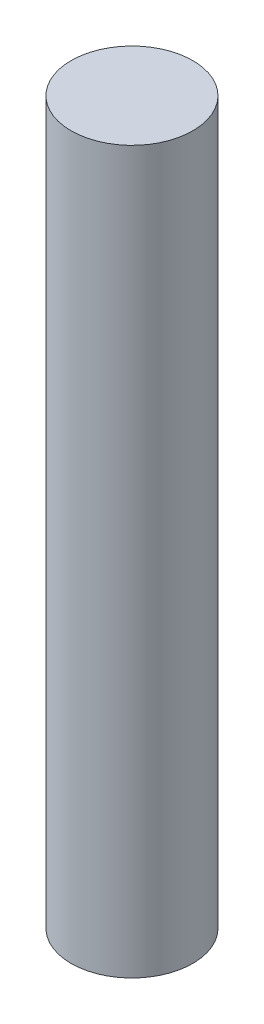
ISO-10303-21;
HEADER;
FILE_DESCRIPTION(('STEP AP214'),'2;1');
FILE_NAME('part.step','',(''),(''),'','','');
FILE_SCHEMA(('AUTOMOTIVE_DESIGN { 1 0 10303 214 1 1 1 1 }'));
ENDSEC;
DATA;
#1=APPLICATION_CONTEXT('core data for automotive mechanical design processes');
#2=APPLICATION_PROTOCOL_DEFINITION('international standard','automotive_design',2000,#1);
#3=PRODUCT_CONTEXT('',#1,'mechanical');
#4=PRODUCT('Part','Part','',(#3));
#5=PRODUCT_RELATED_PRODUCT_CATEGORY('part','',(#4));
#6=PRODUCT_DEFINITION_FORMATION('','',#4);
#7=PRODUCT_DEFINITION_CONTEXT('part definition',#1,'design');
#8=PRODUCT_DEFINITION('design','',#6,#7);
#9=PRODUCT_DEFINITION_SHAPE('','',#8);
#10=(LENGTH_UNIT() NAMED_UNIT(*) SI_UNIT(.MILLI.,.METRE.));
#11=(NAMED_UNIT(*) PLANE_ANGLE_UNIT() SI_UNIT($,.RADIAN.));
#12=(NAMED_UNIT(*) SI_UNIT($,.STERADIAN.) SOLID_ANGLE_UNIT());
#13=UNCERTAINTY_MEASURE_WITH_UNIT(LENGTH_MEASURE(1.E-05),#10,'distance_accuracy_value','');
#14=(GEOMETRIC_REPRESENTATION_CONTEXT(3) GLOBAL_UNCERTAINTY_ASSIGNED_CONTEXT((#13)) GLOBAL_UNIT_ASSIGNED_CONTEXT((#10,
#11,#12)) REPRESENTATION_CONTEXT('',''));
#15=CARTESIAN_POINT('',(0.,0.,0.));
#16=DIRECTION('',(0.,0.,1.));
#17=DIRECTION('',(1.,0.,0.));
#18=AXIS2_PLACEMENT_3D('',#15,#16,#17);
#19=CARTESIAN_POINT('',(0.,0.,0.));
#20=DIRECTION('',(0.,1.,0.));
#21=DIRECTION('',(0.,0.,1.));
#22=AXIS2_PLACEMENT_3D('',#19,#20,#21);
#23=PLANE('',#22);
#24=CARTESIAN_POINT('',(0.,0.,0.));
#25=DIRECTION('',(0.,1.,0.));
#26=DIRECTION('',(0.,0.,1.));
#27=AXIS2_PLACEMENT_3D('',#24,#25,#26);
#28=CIRCLE('',#27,6.75);
#29=CARTESIAN_POINT('',(0.,0.,6.75));
#30=VERTEX_POINT('',#29);
#31=EDGE_CURVE('E39',#30,#30,#28,.T.);
#32=ORIENTED_EDGE('',*,*,#31,.F.);
#33=EDGE_LOOP('',(#32));
#34=FACE_BOUND('',#33,.T.);
#35=ADVANCED_FACE('F32',(#34),#23,.F.);
#36=CARTESIAN_POINT('',(0.,80.,0.));
#37=DIRECTION('',(0.,1.,0.));
#38=DIRECTION('',(0.,0.,1.));
#39=AXIS2_PLACEMENT_3D('',#36,#37,#38);
#40=PLANE('',#39);
#41=CARTESIAN_POINT('',(0.,80.,0.));
#42=DIRECTION('',(0.,1.,0.));
#43=DIRECTION('',(0.,0.,1.));
#44=AXIS2_PLACEMENT_3D('',#41,#42,#43);
#45=CIRCLE('',#44,6.75);
#46=CARTESIAN_POINT('',(0.,80.,6.75));
#47=VERTEX_POINT('',#46);
#48=EDGE_CURVE('E11',#47,#47,#45,.T.);
#49=ORIENTED_EDGE('',*,*,#48,.T.);
#50=EDGE_LOOP('',(#49));
#51=FACE_BOUND('',#50,.T.);
#52=ADVANCED_FACE('F46',(#51),#40,.T.);
#53=CARTESIAN_POINT('',(0.,0.,0.));
#54=DIRECTION('',(0.,1.,0.));
#55=DIRECTION('',(0.,0.,1.));
#56=AXIS2_PLACEMENT_3D('',#53,#54,#55);
#57=CYLINDRICAL_SURFACE('',#56,6.75);
#58=ORIENTED_EDGE('',*,*,#48,.F.);
#59=EDGE_LOOP('',(#58));
#60=FACE_BOUND('',#59,.T.);
#61=ORIENTED_EDGE('',*,*,#31,.T.);
#62=EDGE_LOOP('',(#61));
#63=FACE_BOUND('',#62,.T.);
#64=ADVANCED_FACE('F48',(#60,#63),#57,.T.);
#65=CLOSED_SHELL('',(#35,#52,#64));
#66=MANIFOLD_SOLID_BREP('B2',#65);
#67=ADVANCED_BREP_SHAPE_REPRESENTATION('',(#18,#66),#14);
#68=SHAPE_DEFINITION_REPRESENTATION(#9,#67);
ENDSEC;
END-ISO-10303-21;
